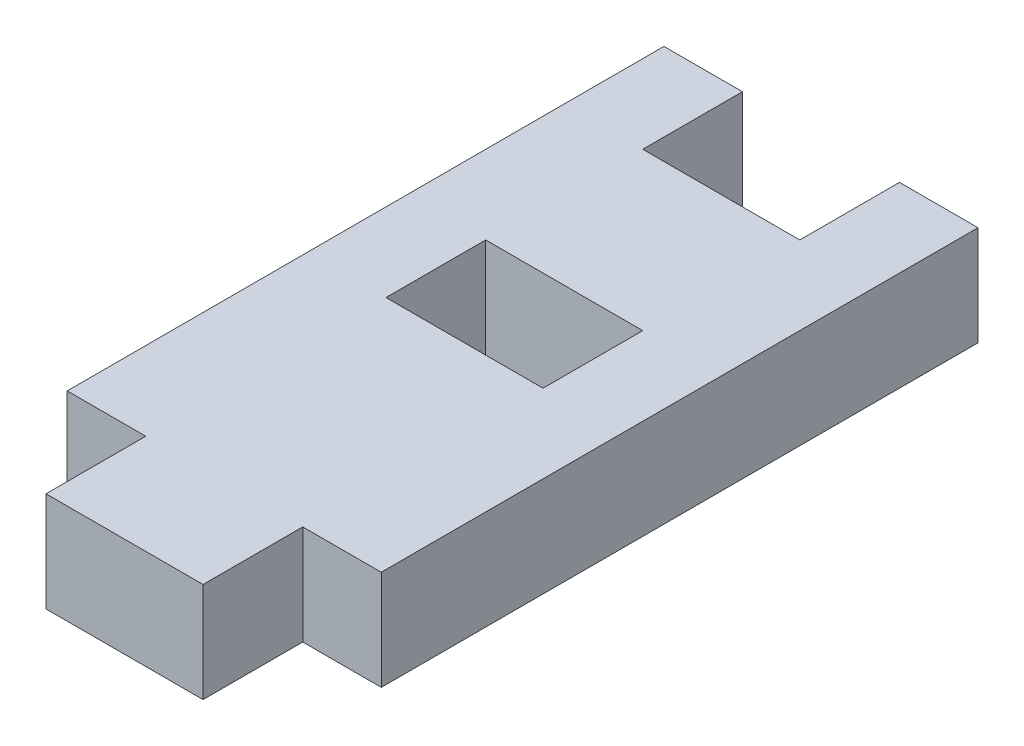
ISO-10303-21;
HEADER;
FILE_DESCRIPTION(('STEP AP214'),'2;1');
FILE_NAME('part.step','',(''),(''),'','','');
FILE_SCHEMA(('AUTOMOTIVE_DESIGN { 1 0 10303 214 1 1 1 1 }'));
ENDSEC;
DATA;
#1=APPLICATION_CONTEXT('core data for automotive mechanical design processes');
#2=APPLICATION_PROTOCOL_DEFINITION('international standard','automotive_design',2000,#1);
#3=PRODUCT_CONTEXT('',#1,'mechanical');
#4=PRODUCT('Part','Part','',(#3));
#5=PRODUCT_RELATED_PRODUCT_CATEGORY('part','',(#4));
#6=PRODUCT_DEFINITION_FORMATION('','',#4);
#7=PRODUCT_DEFINITION_CONTEXT('part definition',#1,'design');
#8=PRODUCT_DEFINITION('design','',#6,#7);
#9=PRODUCT_DEFINITION_SHAPE('','',#8);
#10=(LENGTH_UNIT() NAMED_UNIT(*) SI_UNIT(.MILLI.,.METRE.));
#11=(NAMED_UNIT(*) PLANE_ANGLE_UNIT() SI_UNIT($,.RADIAN.));
#12=(NAMED_UNIT(*) SI_UNIT($,.STERADIAN.) SOLID_ANGLE_UNIT());
#13=UNCERTAINTY_MEASURE_WITH_UNIT(LENGTH_MEASURE(1.E-05),#10,'distance_accuracy_value','');
#14=(GEOMETRIC_REPRESENTATION_CONTEXT(3) GLOBAL_UNCERTAINTY_ASSIGNED_CONTEXT((#13)) GLOBAL_UNIT_ASSIGNED_CONTEXT((#10,
#11,#12)) REPRESENTATION_CONTEXT('',''));
#15=CARTESIAN_POINT('',(0.,0.,0.));
#16=DIRECTION('',(0.,0.,1.));
#17=DIRECTION('',(1.,0.,0.));
#18=AXIS2_PLACEMENT_3D('',#15,#16,#17);
#19=CARTESIAN_POINT('',(0.,6.35,0.));
#20=DIRECTION('',(0.,1.,0.));
#21=DIRECTION('',(0.,0.,1.));
#22=AXIS2_PLACEMENT_3D('',#19,#20,#21);
#23=PLANE('',#22);
#24=DIRECTION('',(0.,0.,1.));
#25=VECTOR('',#24,1.);
#26=CARTESIAN_POINT('',(0.,6.35,-38.));
#27=LINE('',#26,#25);
#28=CARTESIAN_POINT('',(0.,6.35,-38.));
#29=VERTEX_POINT('',#28);
#30=CARTESIAN_POINT('',(0.,6.35,0.));
#31=VERTEX_POINT('',#30);
#32=EDGE_CURVE('E181',#29,#31,#27,.T.);
#33=ORIENTED_EDGE('',*,*,#32,.T.);
#34=DIRECTION('',(1.,0.,0.));
#35=VECTOR('',#34,1.);
#36=CARTESIAN_POINT('',(0.,6.35,0.));
#37=LINE('',#36,#35);
#38=CARTESIAN_POINT('',(5.,6.35,0.));
#39=VERTEX_POINT('',#38);
#40=EDGE_CURVE('E184',#31,#39,#37,.T.);
#41=ORIENTED_EDGE('',*,*,#40,.T.);
#42=DIRECTION('',(0.,0.,1.));
#43=VECTOR('',#42,1.);
#44=CARTESIAN_POINT('',(5.,6.35,0.));
#45=LINE('',#44,#43);
#46=CARTESIAN_POINT('',(5.,6.35,6.35));
#47=VERTEX_POINT('',#46);
#48=EDGE_CURVE('E187',#39,#47,#45,.T.);
#49=ORIENTED_EDGE('',*,*,#48,.T.);
#50=DIRECTION('',(1.,0.,0.));
#51=VECTOR('',#50,1.);
#52=CARTESIAN_POINT('',(5.,6.35,6.35));
#53=LINE('',#52,#51);
#54=CARTESIAN_POINT('',(15.,6.35,6.35));
#55=VERTEX_POINT('',#54);
#56=EDGE_CURVE('E189',#47,#55,#53,.T.);
#57=ORIENTED_EDGE('',*,*,#56,.T.);
#58=DIRECTION('',(0.,0.,-1.));
#59=VECTOR('',#58,1.);
#60=CARTESIAN_POINT('',(15.,6.35,6.35));
#61=LINE('',#60,#59);
#62=CARTESIAN_POINT('',(15.,6.35,0.));
#63=VERTEX_POINT('',#62);
#64=EDGE_CURVE('E191',#55,#63,#61,.T.);
#65=ORIENTED_EDGE('',*,*,#64,.T.);
#66=DIRECTION('',(1.,0.,0.));
#67=VECTOR('',#66,1.);
#68=CARTESIAN_POINT('',(15.,6.35,0.));
#69=LINE('',#68,#67);
#70=CARTESIAN_POINT('',(20.,6.35,0.));
#71=VERTEX_POINT('',#70);
#72=EDGE_CURVE('E193',#63,#71,#69,.T.);
#73=ORIENTED_EDGE('',*,*,#72,.T.);
#74=DIRECTION('',(0.,0.,-1.));
#75=VECTOR('',#74,1.);
#76=CARTESIAN_POINT('',(20.,6.35,0.));
#77=LINE('',#76,#75);
#78=CARTESIAN_POINT('',(20.,6.35,-38.));
#79=VERTEX_POINT('',#78);
#80=EDGE_CURVE('E195',#71,#79,#77,.T.);
#81=ORIENTED_EDGE('',*,*,#80,.T.);
#82=DIRECTION('',(-1.,0.,0.));
#83=VECTOR('',#82,1.);
#84=CARTESIAN_POINT('',(20.,6.35,-38.));
#85=LINE('',#84,#83);
#86=CARTESIAN_POINT('',(15.,6.35,-38.));
#87=VERTEX_POINT('',#86);
#88=EDGE_CURVE('E197',#79,#87,#85,.T.);
#89=ORIENTED_EDGE('',*,*,#88,.T.);
#90=DIRECTION('',(0.,0.,1.));
#91=VECTOR('',#90,1.);
#92=CARTESIAN_POINT('',(15.,6.35,-38.));
#93=LINE('',#92,#91);
#94=CARTESIAN_POINT('',(15.,6.35,-31.65));
#95=VERTEX_POINT('',#94);
#96=EDGE_CURVE('E199',#87,#95,#93,.T.);
#97=ORIENTED_EDGE('',*,*,#96,.T.);
#98=DIRECTION('',(-1.,0.,0.));
#99=VECTOR('',#98,1.);
#100=CARTESIAN_POINT('',(15.,6.35,-31.65));
#101=LINE('',#100,#99);
#102=CARTESIAN_POINT('',(5.,6.35,-31.65));
#103=VERTEX_POINT('',#102);
#104=EDGE_CURVE('E201',#95,#103,#101,.T.);
#105=ORIENTED_EDGE('',*,*,#104,.T.);
#106=DIRECTION('',(0.,0.,-1.));
#107=VECTOR('',#106,1.);
#108=CARTESIAN_POINT('',(5.,6.35,-31.65));
#109=LINE('',#108,#107);
#110=CARTESIAN_POINT('',(5.,6.35,-38.));
#111=VERTEX_POINT('',#110);
#112=EDGE_CURVE('E203',#103,#111,#109,.T.);
#113=ORIENTED_EDGE('',*,*,#112,.T.);
#114=DIRECTION('',(-1.,0.,0.));
#115=VECTOR('',#114,1.);
#116=CARTESIAN_POINT('',(5.,6.35,-38.));
#117=LINE('',#116,#115);
#118=EDGE_CURVE('E205',#111,#29,#117,.T.);
#119=ORIENTED_EDGE('',*,*,#118,.T.);
#120=EDGE_LOOP('',(#33,#41,#49,#57,#65,#73,#81,#89,#97,#105,#113,#119));
#121=FACE_BOUND('',#120,.T.);
#122=DIRECTION('',(0.,0.,1.));
#123=VECTOR('',#122,1.);
#124=CARTESIAN_POINT('',(5.,6.35,-21.65));
#125=LINE('',#124,#123);
#126=CARTESIAN_POINT('',(5.,6.35,-21.65));
#127=VERTEX_POINT('',#126);
#128=CARTESIAN_POINT('',(5.,6.35,-15.3));
#129=VERTEX_POINT('',#128);
#130=EDGE_CURVE('E153',#127,#129,#125,.T.);
#131=ORIENTED_EDGE('',*,*,#130,.F.);
#132=DIRECTION('',(-1.,0.,0.));
#133=VECTOR('',#132,1.);
#134=CARTESIAN_POINT('',(15.,6.35,-21.65));
#135=LINE('',#134,#133);
#136=CARTESIAN_POINT('',(15.,6.35,-21.65));
#137=VERTEX_POINT('',#136);
#138=EDGE_CURVE('E145',#137,#127,#135,.T.);
#139=ORIENTED_EDGE('',*,*,#138,.F.);
#140=DIRECTION('',(0.,0.,-1.));
#141=VECTOR('',#140,1.);
#142=CARTESIAN_POINT('',(15.,6.35,-15.3));
#143=LINE('',#142,#141);
#144=CARTESIAN_POINT('',(15.,6.35,-15.3));
#145=VERTEX_POINT('',#144);
#146=EDGE_CURVE('E167',#145,#137,#143,.T.);
#147=ORIENTED_EDGE('',*,*,#146,.F.);
#148=DIRECTION('',(1.,0.,0.));
#149=VECTOR('',#148,1.);
#150=CARTESIAN_POINT('',(5.,6.35,-15.3));
#151=LINE('',#150,#149);
#152=EDGE_CURVE('E165',#129,#145,#151,.T.);
#153=ORIENTED_EDGE('',*,*,#152,.F.);
#154=EDGE_LOOP('',(#131,#139,#147,#153));
#155=FACE_BOUND('',#154,.T.);
#156=ADVANCED_FACE('F32',(#121,#155),#23,.T.);
#157=CARTESIAN_POINT('',(0.,0.,0.));
#158=DIRECTION('',(0.,1.,0.));
#159=DIRECTION('',(0.,0.,1.));
#160=AXIS2_PLACEMENT_3D('',#157,#158,#159);
#161=PLANE('',#160);
#162=DIRECTION('',(0.,0.,1.));
#163=VECTOR('',#162,1.);
#164=CARTESIAN_POINT('',(0.,0.,-38.));
#165=LINE('',#164,#163);
#166=CARTESIAN_POINT('',(0.,0.,-38.));
#167=VERTEX_POINT('',#166);
#168=CARTESIAN_POINT('',(0.,0.,0.));
#169=VERTEX_POINT('',#168);
#170=EDGE_CURVE('E161',#167,#169,#165,.T.);
#171=ORIENTED_EDGE('',*,*,#170,.F.);
#172=DIRECTION('',(-1.,0.,0.));
#173=VECTOR('',#172,1.);
#174=CARTESIAN_POINT('',(5.,0.,-38.));
#175=LINE('',#174,#173);
#176=CARTESIAN_POINT('',(5.,0.,-38.));
#177=VERTEX_POINT('',#176);
#178=EDGE_CURVE('E185',#177,#167,#175,.T.);
#179=ORIENTED_EDGE('',*,*,#178,.F.);
#180=DIRECTION('',(0.,0.,-1.));
#181=VECTOR('',#180,1.);
#182=CARTESIAN_POINT('',(5.,0.,-31.65));
#183=LINE('',#182,#181);
#184=CARTESIAN_POINT('',(5.,0.,-31.65));
#185=VERTEX_POINT('',#184);
#186=EDGE_CURVE('E228',#185,#177,#183,.T.);
#187=ORIENTED_EDGE('',*,*,#186,.F.);
#188=DIRECTION('',(-1.,0.,0.));
#189=VECTOR('',#188,1.);
#190=CARTESIAN_POINT('',(15.,0.,-31.65));
#191=LINE('',#190,#189);
#192=CARTESIAN_POINT('',(15.,0.,-31.65));
#193=VERTEX_POINT('',#192);
#194=EDGE_CURVE('E226',#193,#185,#191,.T.);
#195=ORIENTED_EDGE('',*,*,#194,.F.);
#196=DIRECTION('',(0.,0.,1.));
#197=VECTOR('',#196,1.);
#198=CARTESIAN_POINT('',(15.,0.,-38.));
#199=LINE('',#198,#197);
#200=CARTESIAN_POINT('',(15.,0.,-38.));
#201=VERTEX_POINT('',#200);
#202=EDGE_CURVE('E224',#201,#193,#199,.T.);
#203=ORIENTED_EDGE('',*,*,#202,.F.);
#204=DIRECTION('',(-1.,0.,0.));
#205=VECTOR('',#204,1.);
#206=CARTESIAN_POINT('',(20.,0.,-38.));
#207=LINE('',#206,#205);
#208=CARTESIAN_POINT('',(20.,0.,-38.));
#209=VERTEX_POINT('',#208);
#210=EDGE_CURVE('E222',#209,#201,#207,.T.);
#211=ORIENTED_EDGE('',*,*,#210,.F.);
#212=DIRECTION('',(0.,0.,-1.));
#213=VECTOR('',#212,1.);
#214=CARTESIAN_POINT('',(20.,0.,0.));
#215=LINE('',#214,#213);
#216=CARTESIAN_POINT('',(20.,0.,0.));
#217=VERTEX_POINT('',#216);
#218=EDGE_CURVE('E220',#217,#209,#215,.T.);
#219=ORIENTED_EDGE('',*,*,#218,.F.);
#220=DIRECTION('',(1.,0.,0.));
#221=VECTOR('',#220,1.);
#222=CARTESIAN_POINT('',(15.,0.,0.));
#223=LINE('',#222,#221);
#224=CARTESIAN_POINT('',(15.,0.,0.));
#225=VERTEX_POINT('',#224);
#226=EDGE_CURVE('E218',#225,#217,#223,.T.);
#227=ORIENTED_EDGE('',*,*,#226,.F.);
#228=DIRECTION('',(0.,0.,-1.));
#229=VECTOR('',#228,1.);
#230=CARTESIAN_POINT('',(15.,0.,6.35));
#231=LINE('',#230,#229);
#232=CARTESIAN_POINT('',(15.,0.,6.35));
#233=VERTEX_POINT('',#232);
#234=EDGE_CURVE('E216',#233,#225,#231,.T.);
#235=ORIENTED_EDGE('',*,*,#234,.F.);
#236=DIRECTION('',(1.,0.,0.));
#237=VECTOR('',#236,1.);
#238=CARTESIAN_POINT('',(5.,0.,6.35));
#239=LINE('',#238,#237);
#240=CARTESIAN_POINT('',(5.,0.,6.35));
#241=VERTEX_POINT('',#240);
#242=EDGE_CURVE('E214',#241,#233,#239,.T.);
#243=ORIENTED_EDGE('',*,*,#242,.F.);
#244=DIRECTION('',(0.,0.,1.));
#245=VECTOR('',#244,1.);
#246=CARTESIAN_POINT('',(5.,0.,0.));
#247=LINE('',#246,#245);
#248=CARTESIAN_POINT('',(5.,0.,0.));
#249=VERTEX_POINT('',#248);
#250=EDGE_CURVE('E212',#249,#241,#247,.T.);
#251=ORIENTED_EDGE('',*,*,#250,.F.);
#252=DIRECTION('',(1.,0.,0.));
#253=VECTOR('',#252,1.);
#254=CARTESIAN_POINT('',(0.,0.,0.));
#255=LINE('',#254,#253);
#256=EDGE_CURVE('E210',#169,#249,#255,.T.);
#257=ORIENTED_EDGE('',*,*,#256,.F.);
#258=EDGE_LOOP('',(#171,#179,#187,#195,#203,#211,#219,#227,#235,#243,#251,#257));
#259=FACE_BOUND('',#258,.T.);
#260=DIRECTION('',(-1.,0.,0.));
#261=VECTOR('',#260,1.);
#262=CARTESIAN_POINT('',(15.,0.,-21.65));
#263=LINE('',#262,#261);
#264=CARTESIAN_POINT('',(15.,0.,-21.65));
#265=VERTEX_POINT('',#264);
#266=CARTESIAN_POINT('',(5.,0.,-21.65));
#267=VERTEX_POINT('',#266);
#268=EDGE_CURVE('E55',#265,#267,#263,.T.);
#269=ORIENTED_EDGE('',*,*,#268,.T.);
#270=DIRECTION('',(0.,0.,1.));
#271=VECTOR('',#270,1.);
#272=CARTESIAN_POINT('',(5.,0.,-21.65));
#273=LINE('',#272,#271);
#274=CARTESIAN_POINT('',(5.,0.,-15.3));
#275=VERTEX_POINT('',#274);
#276=EDGE_CURVE('E160',#267,#275,#273,.T.);
#277=ORIENTED_EDGE('',*,*,#276,.T.);
#278=DIRECTION('',(1.,0.,0.));
#279=VECTOR('',#278,1.);
#280=CARTESIAN_POINT('',(5.,0.,-15.3));
#281=LINE('',#280,#279);
#282=CARTESIAN_POINT('',(15.,0.,-15.3));
#283=VERTEX_POINT('',#282);
#284=EDGE_CURVE('E173',#275,#283,#281,.T.);
#285=ORIENTED_EDGE('',*,*,#284,.T.);
#286=DIRECTION('',(0.,0.,-1.));
#287=VECTOR('',#286,1.);
#288=CARTESIAN_POINT('',(15.,0.,-15.3));
#289=LINE('',#288,#287);
#290=EDGE_CURVE('E154',#283,#265,#289,.T.);
#291=ORIENTED_EDGE('',*,*,#290,.T.);
#292=EDGE_LOOP('',(#269,#277,#285,#291));
#293=FACE_BOUND('',#292,.T.);
#294=ADVANCED_FACE('F270',(#259,#293),#161,.F.);
#295=CARTESIAN_POINT('',(0.,6.35,-38.));
#296=DIRECTION('',(1.,0.,0.));
#297=DIRECTION('',(0.,0.,-1.));
#298=AXIS2_PLACEMENT_3D('',#295,#296,#297);
#299=PLANE('',#298);
#300=ORIENTED_EDGE('',*,*,#170,.T.);
#301=DIRECTION('',(0.,-1.,0.));
#302=VECTOR('',#301,1.);
#303=CARTESIAN_POINT('',(0.,6.35,0.));
#304=LINE('',#303,#302);
#305=EDGE_CURVE('E11',#31,#169,#304,.T.);
#306=ORIENTED_EDGE('',*,*,#305,.F.);
#307=ORIENTED_EDGE('',*,*,#32,.F.);
#308=DIRECTION('',(0.,-1.,0.));
#309=VECTOR('',#308,1.);
#310=CARTESIAN_POINT('',(0.,6.35,-38.));
#311=LINE('',#310,#309);
#312=EDGE_CURVE('E207',#29,#167,#311,.T.);
#313=ORIENTED_EDGE('',*,*,#312,.T.);
#314=EDGE_LOOP('',(#300,#306,#307,#313));
#315=FACE_BOUND('',#314,.T.);
#316=ADVANCED_FACE('F34',(#315),#299,.F.);
#317=CARTESIAN_POINT('',(0.,6.35,0.));
#318=DIRECTION('',(0.,0.,-1.));
#319=DIRECTION('',(-1.,0.,0.));
#320=AXIS2_PLACEMENT_3D('',#317,#318,#319);
#321=PLANE('',#320);
#322=ORIENTED_EDGE('',*,*,#256,.T.);
#323=DIRECTION('',(0.,-1.,0.));
#324=VECTOR('',#323,1.);
#325=CARTESIAN_POINT('',(5.,6.35,0.));
#326=LINE('',#325,#324);
#327=EDGE_CURVE('E40',#39,#249,#326,.T.);
#328=ORIENTED_EDGE('',*,*,#327,.F.);
#329=ORIENTED_EDGE('',*,*,#40,.F.);
#330=ORIENTED_EDGE('',*,*,#305,.T.);
#331=EDGE_LOOP('',(#322,#328,#329,#330));
#332=FACE_BOUND('',#331,.T.);
#333=ADVANCED_FACE('F287',(#332),#321,.F.);
#334=CARTESIAN_POINT('',(5.,6.35,0.));
#335=DIRECTION('',(1.,0.,0.));
#336=DIRECTION('',(0.,0.,-1.));
#337=AXIS2_PLACEMENT_3D('',#334,#335,#336);
#338=PLANE('',#337);
#339=ORIENTED_EDGE('',*,*,#250,.T.);
#340=DIRECTION('',(0.,-1.,0.));
#341=VECTOR('',#340,1.);
#342=CARTESIAN_POINT('',(5.,6.35,6.35));
#343=LINE('',#342,#341);
#344=EDGE_CURVE('E257',#47,#241,#343,.T.);
#345=ORIENTED_EDGE('',*,*,#344,.F.);
#346=ORIENTED_EDGE('',*,*,#48,.F.);
#347=ORIENTED_EDGE('',*,*,#327,.T.);
#348=EDGE_LOOP('',(#339,#345,#346,#347));
#349=FACE_BOUND('',#348,.T.);
#350=ADVANCED_FACE('F264',(#349),#338,.F.);
#351=CARTESIAN_POINT('',(5.,6.35,6.35));
#352=DIRECTION('',(0.,0.,-1.));
#353=DIRECTION('',(-1.,0.,0.));
#354=AXIS2_PLACEMENT_3D('',#351,#352,#353);
#355=PLANE('',#354);
#356=ORIENTED_EDGE('',*,*,#242,.T.);
#357=DIRECTION('',(0.,-1.,0.));
#358=VECTOR('',#357,1.);
#359=CARTESIAN_POINT('',(15.,6.35,6.35));
#360=LINE('',#359,#358);
#361=EDGE_CURVE('E254',#55,#233,#360,.T.);
#362=ORIENTED_EDGE('',*,*,#361,.F.);
#363=ORIENTED_EDGE('',*,*,#56,.F.);
#364=ORIENTED_EDGE('',*,*,#344,.T.);
#365=EDGE_LOOP('',(#356,#362,#363,#364));
#366=FACE_BOUND('',#365,.T.);
#367=ADVANCED_FACE('F276',(#366),#355,.F.);
#368=CARTESIAN_POINT('',(15.,6.35,6.35));
#369=DIRECTION('',(-1.,0.,0.));
#370=DIRECTION('',(0.,0.,1.));
#371=AXIS2_PLACEMENT_3D('',#368,#369,#370);
#372=PLANE('',#371);
#373=ORIENTED_EDGE('',*,*,#234,.T.);
#374=DIRECTION('',(0.,-1.,0.));
#375=VECTOR('',#374,1.);
#376=CARTESIAN_POINT('',(15.,6.35,0.));
#377=LINE('',#376,#375);
#378=EDGE_CURVE('E251',#63,#225,#377,.T.);
#379=ORIENTED_EDGE('',*,*,#378,.F.);
#380=ORIENTED_EDGE('',*,*,#64,.F.);
#381=ORIENTED_EDGE('',*,*,#361,.T.);
#382=EDGE_LOOP('',(#373,#379,#380,#381));
#383=FACE_BOUND('',#382,.T.);
#384=ADVANCED_FACE('F280',(#383),#372,.F.);
#385=CARTESIAN_POINT('',(15.,6.35,0.));
#386=DIRECTION('',(0.,0.,-1.));
#387=DIRECTION('',(-1.,0.,0.));
#388=AXIS2_PLACEMENT_3D('',#385,#386,#387);
#389=PLANE('',#388);
#390=ORIENTED_EDGE('',*,*,#226,.T.);
#391=DIRECTION('',(0.,-1.,0.));
#392=VECTOR('',#391,1.);
#393=CARTESIAN_POINT('',(20.,6.35,0.));
#394=LINE('',#393,#392);
#395=EDGE_CURVE('E248',#71,#217,#394,.T.);
#396=ORIENTED_EDGE('',*,*,#395,.F.);
#397=ORIENTED_EDGE('',*,*,#72,.F.);
#398=ORIENTED_EDGE('',*,*,#378,.T.);
#399=EDGE_LOOP('',(#390,#396,#397,#398));
#400=FACE_BOUND('',#399,.T.);
#401=ADVANCED_FACE('F320',(#400),#389,.F.);
#402=CARTESIAN_POINT('',(20.,6.35,0.));
#403=DIRECTION('',(-1.,0.,0.));
#404=DIRECTION('',(0.,0.,1.));
#405=AXIS2_PLACEMENT_3D('',#402,#403,#404);
#406=PLANE('',#405);
#407=ORIENTED_EDGE('',*,*,#218,.T.);
#408=DIRECTION('',(0.,-1.,0.));
#409=VECTOR('',#408,1.);
#410=CARTESIAN_POINT('',(20.,6.35,-38.));
#411=LINE('',#410,#409);
#412=EDGE_CURVE('E245',#79,#209,#411,.T.);
#413=ORIENTED_EDGE('',*,*,#412,.F.);
#414=ORIENTED_EDGE('',*,*,#80,.F.);
#415=ORIENTED_EDGE('',*,*,#395,.T.);
#416=EDGE_LOOP('',(#407,#413,#414,#415));
#417=FACE_BOUND('',#416,.T.);
#418=ADVANCED_FACE('F318',(#417),#406,.F.);
#419=CARTESIAN_POINT('',(20.,6.35,-38.));
#420=DIRECTION('',(0.,0.,1.));
#421=DIRECTION('',(1.,0.,0.));
#422=AXIS2_PLACEMENT_3D('',#419,#420,#421);
#423=PLANE('',#422);
#424=ORIENTED_EDGE('',*,*,#210,.T.);
#425=DIRECTION('',(0.,-1.,0.));
#426=VECTOR('',#425,1.);
#427=CARTESIAN_POINT('',(15.,6.35,-38.));
#428=LINE('',#427,#426);
#429=EDGE_CURVE('E242',#87,#201,#428,.T.);
#430=ORIENTED_EDGE('',*,*,#429,.F.);
#431=ORIENTED_EDGE('',*,*,#88,.F.);
#432=ORIENTED_EDGE('',*,*,#412,.T.);
#433=EDGE_LOOP('',(#424,#430,#431,#432));
#434=FACE_BOUND('',#433,.T.);
#435=ADVANCED_FACE('F314',(#434),#423,.F.);
#436=CARTESIAN_POINT('',(15.,6.35,-38.));
#437=DIRECTION('',(1.,0.,0.));
#438=DIRECTION('',(0.,0.,-1.));
#439=AXIS2_PLACEMENT_3D('',#436,#437,#438);
#440=PLANE('',#439);
#441=ORIENTED_EDGE('',*,*,#202,.T.);
#442=DIRECTION('',(0.,-1.,0.));
#443=VECTOR('',#442,1.);
#444=CARTESIAN_POINT('',(15.,6.35,-31.65));
#445=LINE('',#444,#443);
#446=EDGE_CURVE('E239',#95,#193,#445,.T.);
#447=ORIENTED_EDGE('',*,*,#446,.F.);
#448=ORIENTED_EDGE('',*,*,#96,.F.);
#449=ORIENTED_EDGE('',*,*,#429,.T.);
#450=EDGE_LOOP('',(#441,#447,#448,#449));
#451=FACE_BOUND('',#450,.T.);
#452=ADVANCED_FACE('F309',(#451),#440,.F.);
#453=CARTESIAN_POINT('',(15.,6.35,-31.65));
#454=DIRECTION('',(0.,0.,1.));
#455=DIRECTION('',(1.,0.,0.));
#456=AXIS2_PLACEMENT_3D('',#453,#454,#455);
#457=PLANE('',#456);
#458=ORIENTED_EDGE('',*,*,#194,.T.);
#459=DIRECTION('',(0.,-1.,0.));
#460=VECTOR('',#459,1.);
#461=CARTESIAN_POINT('',(5.,6.35,-31.65));
#462=LINE('',#461,#460);
#463=EDGE_CURVE('E236',#103,#185,#462,.T.);
#464=ORIENTED_EDGE('',*,*,#463,.F.);
#465=ORIENTED_EDGE('',*,*,#104,.F.);
#466=ORIENTED_EDGE('',*,*,#446,.T.);
#467=EDGE_LOOP('',(#458,#464,#465,#466));
#468=FACE_BOUND('',#467,.T.);
#469=ADVANCED_FACE('F303',(#468),#457,.F.);
#470=CARTESIAN_POINT('',(5.,6.35,-31.65));
#471=DIRECTION('',(-1.,0.,0.));
#472=DIRECTION('',(0.,0.,1.));
#473=AXIS2_PLACEMENT_3D('',#470,#471,#472);
#474=PLANE('',#473);
#475=ORIENTED_EDGE('',*,*,#186,.T.);
#476=DIRECTION('',(0.,-1.,0.));
#477=VECTOR('',#476,1.);
#478=CARTESIAN_POINT('',(5.,6.35,-38.));
#479=LINE('',#478,#477);
#480=EDGE_CURVE('E233',#111,#177,#479,.T.);
#481=ORIENTED_EDGE('',*,*,#480,.F.);
#482=ORIENTED_EDGE('',*,*,#112,.F.);
#483=ORIENTED_EDGE('',*,*,#463,.T.);
#484=EDGE_LOOP('',(#475,#481,#482,#483));
#485=FACE_BOUND('',#484,.T.);
#486=ADVANCED_FACE('F299',(#485),#474,.F.);
#487=CARTESIAN_POINT('',(5.,6.35,-38.));
#488=DIRECTION('',(0.,0.,1.));
#489=DIRECTION('',(1.,0.,0.));
#490=AXIS2_PLACEMENT_3D('',#487,#488,#489);
#491=PLANE('',#490);
#492=ORIENTED_EDGE('',*,*,#178,.T.);
#493=ORIENTED_EDGE('',*,*,#312,.F.);
#494=ORIENTED_EDGE('',*,*,#118,.F.);
#495=ORIENTED_EDGE('',*,*,#480,.T.);
#496=EDGE_LOOP('',(#492,#493,#494,#495));
#497=FACE_BOUND('',#496,.T.);
#498=ADVANCED_FACE('F294',(#497),#491,.F.);
#499=CARTESIAN_POINT('',(15.,6.35,-21.65));
#500=DIRECTION('',(0.,0.,1.));
#501=DIRECTION('',(1.,0.,0.));
#502=AXIS2_PLACEMENT_3D('',#499,#500,#501);
#503=PLANE('',#502);
#504=ORIENTED_EDGE('',*,*,#268,.F.);
#505=DIRECTION('',(0.,-1.,0.));
#506=VECTOR('',#505,1.);
#507=CARTESIAN_POINT('',(15.,6.35,-21.65));
#508=LINE('',#507,#506);
#509=EDGE_CURVE('E149',#137,#265,#508,.T.);
#510=ORIENTED_EDGE('',*,*,#509,.F.);
#511=ORIENTED_EDGE('',*,*,#138,.T.);
#512=DIRECTION('',(0.,-1.,0.));
#513=VECTOR('',#512,1.);
#514=CARTESIAN_POINT('',(5.,6.35,-21.65));
#515=LINE('',#514,#513);
#516=EDGE_CURVE('E148',#127,#267,#515,.T.);
#517=ORIENTED_EDGE('',*,*,#516,.T.);
#518=EDGE_LOOP('',(#504,#510,#511,#517));
#519=FACE_BOUND('',#518,.T.);
#520=ADVANCED_FACE('F147',(#519),#503,.T.);
#521=CARTESIAN_POINT('',(5.,6.35,-21.65));
#522=DIRECTION('',(1.,0.,0.));
#523=DIRECTION('',(0.,0.,-1.));
#524=AXIS2_PLACEMENT_3D('',#521,#522,#523);
#525=PLANE('',#524);
#526=ORIENTED_EDGE('',*,*,#276,.F.);
#527=ORIENTED_EDGE('',*,*,#516,.F.);
#528=ORIENTED_EDGE('',*,*,#130,.T.);
#529=DIRECTION('',(0.,-1.,0.));
#530=VECTOR('',#529,1.);
#531=CARTESIAN_POINT('',(5.,6.35,-15.3));
#532=LINE('',#531,#530);
#533=EDGE_CURVE('E162',#129,#275,#532,.T.);
#534=ORIENTED_EDGE('',*,*,#533,.T.);
#535=EDGE_LOOP('',(#526,#527,#528,#534));
#536=FACE_BOUND('',#535,.T.);
#537=ADVANCED_FACE('F157',(#536),#525,.T.);
#538=CARTESIAN_POINT('',(5.,6.35,-15.3));
#539=DIRECTION('',(0.,0.,-1.));
#540=DIRECTION('',(-1.,0.,0.));
#541=AXIS2_PLACEMENT_3D('',#538,#539,#540);
#542=PLANE('',#541);
#543=ORIENTED_EDGE('',*,*,#284,.F.);
#544=ORIENTED_EDGE('',*,*,#533,.F.);
#545=ORIENTED_EDGE('',*,*,#152,.T.);
#546=DIRECTION('',(0.,-1.,0.));
#547=VECTOR('',#546,1.);
#548=CARTESIAN_POINT('',(15.,6.35,-15.3));
#549=LINE('',#548,#547);
#550=EDGE_CURVE('E47',#145,#283,#549,.T.);
#551=ORIENTED_EDGE('',*,*,#550,.T.);
#552=EDGE_LOOP('',(#543,#544,#545,#551));
#553=FACE_BOUND('',#552,.T.);
#554=ADVANCED_FACE('F378',(#553),#542,.T.);
#555=CARTESIAN_POINT('',(15.,6.35,-15.3));
#556=DIRECTION('',(-1.,0.,0.));
#557=DIRECTION('',(0.,0.,1.));
#558=AXIS2_PLACEMENT_3D('',#555,#556,#557);
#559=PLANE('',#558);
#560=ORIENTED_EDGE('',*,*,#290,.F.);
#561=ORIENTED_EDGE('',*,*,#550,.F.);
#562=ORIENTED_EDGE('',*,*,#146,.T.);
#563=ORIENTED_EDGE('',*,*,#509,.T.);
#564=EDGE_LOOP('',(#560,#561,#562,#563));
#565=FACE_BOUND('',#564,.T.);
#566=ADVANCED_FACE('F384',(#565),#559,.T.);
#567=CLOSED_SHELL('',(#156,#294,#316,#333,#350,#367,#384,#401,#418,#435,#452,#469,#486,#498,
#520,#537,#554,#566));
#568=MANIFOLD_SOLID_BREP('B2',#567);
#569=ADVANCED_BREP_SHAPE_REPRESENTATION('',(#18,#568),#14);
#570=SHAPE_DEFINITION_REPRESENTATION(#9,#569);
ENDSEC;
END-ISO-10303-21;
